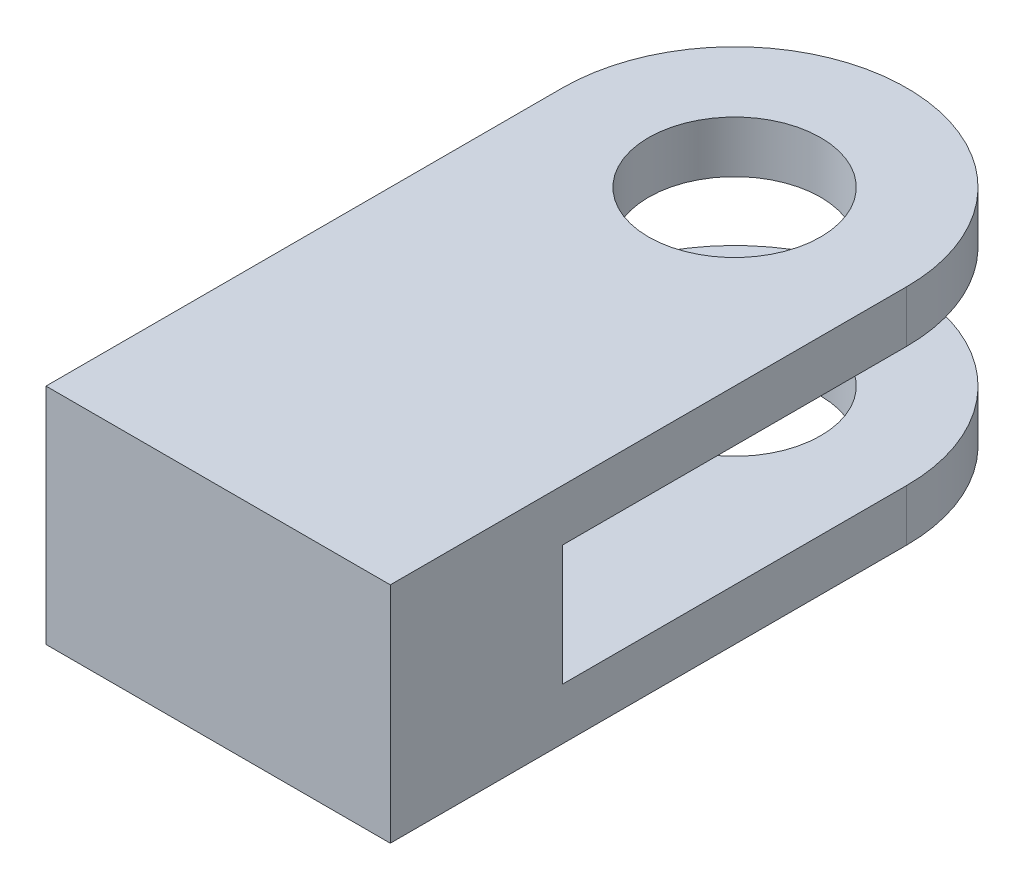
ISO-10303-21;
HEADER;
FILE_DESCRIPTION(('STEP AP214'),'2;1');
FILE_NAME('part.step','',(''),(''),'','','');
FILE_SCHEMA(('AUTOMOTIVE_DESIGN { 1 0 10303 214 1 1 1 1 }'));
ENDSEC;
DATA;
#1=APPLICATION_CONTEXT('core data for automotive mechanical design processes');
#2=APPLICATION_PROTOCOL_DEFINITION('international standard','automotive_design',2000,#1);
#3=PRODUCT_CONTEXT('',#1,'mechanical');
#4=PRODUCT('Part','Part','',(#3));
#5=PRODUCT_RELATED_PRODUCT_CATEGORY('part','',(#4));
#6=PRODUCT_DEFINITION_FORMATION('','',#4);
#7=PRODUCT_DEFINITION_CONTEXT('part definition',#1,'design');
#8=PRODUCT_DEFINITION('design','',#6,#7);
#9=PRODUCT_DEFINITION_SHAPE('','',#8);
#10=(LENGTH_UNIT() NAMED_UNIT(*) SI_UNIT(.MILLI.,.METRE.));
#11=(NAMED_UNIT(*) PLANE_ANGLE_UNIT() SI_UNIT($,.RADIAN.));
#12=(NAMED_UNIT(*) SI_UNIT($,.STERADIAN.) SOLID_ANGLE_UNIT());
#13=UNCERTAINTY_MEASURE_WITH_UNIT(LENGTH_MEASURE(1.E-05),#10,'distance_accuracy_value','');
#14=(GEOMETRIC_REPRESENTATION_CONTEXT(3) GLOBAL_UNCERTAINTY_ASSIGNED_CONTEXT((#13)) GLOBAL_UNIT_ASSIGNED_CONTEXT((#10,
#11,#12)) REPRESENTATION_CONTEXT('',''));
#15=CARTESIAN_POINT('',(0.,0.,0.));
#16=DIRECTION('',(0.,0.,1.));
#17=DIRECTION('',(1.,0.,0.));
#18=AXIS2_PLACEMENT_3D('',#15,#16,#17);
#19=CARTESIAN_POINT('',(10.,6.5,0.));
#20=DIRECTION('',(-1.,0.,0.));
#21=DIRECTION('',(0.,0.,1.));
#22=AXIS2_PLACEMENT_3D('',#19,#20,#21);
#23=PLANE('',#22);
#24=DIRECTION('',(0.,0.,-1.));
#25=VECTOR('',#24,1.);
#26=CARTESIAN_POINT('',(10.,3.5,20.));
#27=LINE('',#26,#25);
#28=CARTESIAN_POINT('',(10.,3.5,20.));
#29=VERTEX_POINT('',#28);
#30=CARTESIAN_POINT('',(10.,3.5,0.));
#31=VERTEX_POINT('',#30);
#32=EDGE_CURVE('E118',#29,#31,#27,.T.);
#33=ORIENTED_EDGE('',*,*,#32,.T.);
#34=DIRECTION('',(0.,-1.,0.));
#35=VECTOR('',#34,1.);
#36=CARTESIAN_POINT('',(10.,6.5,0.));
#37=LINE('',#36,#35);
#38=CARTESIAN_POINT('',(10.,6.5,0.));
#39=VERTEX_POINT('',#38);
#40=EDGE_CURVE('E42',#39,#31,#37,.T.);
#41=ORIENTED_EDGE('',*,*,#40,.F.);
#42=DIRECTION('',(0.,0.,-1.));
#43=VECTOR('',#42,1.);
#44=CARTESIAN_POINT('',(10.,6.5,0.));
#45=LINE('',#44,#43);
#46=CARTESIAN_POINT('',(10.,6.5,30.));
#47=VERTEX_POINT('',#46);
#48=EDGE_CURVE('E85',#47,#39,#45,.T.);
#49=ORIENTED_EDGE('',*,*,#48,.F.);
#50=DIRECTION('',(0.,-1.,0.));
#51=VECTOR('',#50,1.);
#52=CARTESIAN_POINT('',(10.,6.5,30.));
#53=LINE('',#52,#51);
#54=CARTESIAN_POINT('',(10.,-6.5,30.));
#55=VERTEX_POINT('',#54);
#56=EDGE_CURVE('E11',#47,#55,#53,.T.);
#57=ORIENTED_EDGE('',*,*,#56,.T.);
#58=DIRECTION('',(0.,0.,-1.));
#59=VECTOR('',#58,1.);
#60=CARTESIAN_POINT('',(10.,-6.5,0.));
#61=LINE('',#60,#59);
#62=CARTESIAN_POINT('',(10.,-6.5,0.));
#63=VERTEX_POINT('',#62);
#64=EDGE_CURVE('E152',#55,#63,#61,.T.);
#65=ORIENTED_EDGE('',*,*,#64,.T.);
#66=CARTESIAN_POINT('',(10.,-3.5,0.));
#67=VERTEX_POINT('',#66);
#68=EDGE_CURVE('E164',#67,#63,#37,.T.);
#69=ORIENTED_EDGE('',*,*,#68,.F.);
#70=DIRECTION('',(0.,0.,-1.));
#71=VECTOR('',#70,1.);
#72=CARTESIAN_POINT('',(10.,-3.5,20.));
#73=LINE('',#72,#71);
#74=CARTESIAN_POINT('',(10.,-3.5,20.));
#75=VERTEX_POINT('',#74);
#76=EDGE_CURVE('E126',#75,#67,#73,.T.);
#77=ORIENTED_EDGE('',*,*,#76,.F.);
#78=DIRECTION('',(0.,1.,0.));
#79=VECTOR('',#78,1.);
#80=CARTESIAN_POINT('',(10.,-3.5,20.));
#81=LINE('',#80,#79);
#82=EDGE_CURVE('E109',#75,#29,#81,.T.);
#83=ORIENTED_EDGE('',*,*,#82,.T.);
#84=EDGE_LOOP('',(#33,#41,#49,#57,#65,#69,#77,#83));
#85=FACE_BOUND('',#84,.T.);
#86=ADVANCED_FACE('F33',(#85),#23,.F.);
#87=CARTESIAN_POINT('',(0.,6.5,0.));
#88=DIRECTION('',(0.,-1.,0.));
#89=DIRECTION('',(0.,0.,-1.));
#90=AXIS2_PLACEMENT_3D('',#87,#88,#89);
#91=CYLINDRICAL_SURFACE('',#90,10.);
#92=CARTESIAN_POINT('',(0.,3.5,0.));
#93=DIRECTION('',(0.,-1.,0.));
#94=DIRECTION('',(0.,0.,-1.));
#95=AXIS2_PLACEMENT_3D('',#92,#93,#94);
#96=CIRCLE('',#95,10.);
#97=CARTESIAN_POINT('',(-10.,3.5,0.));
#98=VERTEX_POINT('',#97);
#99=EDGE_CURVE('E120',#98,#31,#96,.T.);
#100=ORIENTED_EDGE('',*,*,#99,.F.);
#101=DIRECTION('',(0.,-1.,0.));
#102=VECTOR('',#101,1.);
#103=CARTESIAN_POINT('',(-10.,6.5,0.));
#104=LINE('',#103,#102);
#105=CARTESIAN_POINT('',(-10.,6.5,0.));
#106=VERTEX_POINT('',#105);
#107=EDGE_CURVE('E161',#106,#98,#104,.T.);
#108=ORIENTED_EDGE('',*,*,#107,.F.);
#109=CARTESIAN_POINT('',(0.,6.5,0.));
#110=DIRECTION('',(0.,1.,0.));
#111=DIRECTION('',(0.,0.,-1.));
#112=AXIS2_PLACEMENT_3D('',#109,#110,#111);
#113=CIRCLE('',#112,10.);
#114=EDGE_CURVE('E146',#39,#106,#113,.T.);
#115=ORIENTED_EDGE('',*,*,#114,.F.);
#116=ORIENTED_EDGE('',*,*,#40,.T.);
#117=EDGE_LOOP('',(#100,#108,#115,#116));
#118=FACE_BOUND('',#117,.T.);
#119=ADVANCED_FACE('F180',(#118),#91,.T.);
#120=CARTESIAN_POINT('',(0.,-3.5,0.));
#121=DIRECTION('',(0.,1.,0.));
#122=DIRECTION('',(0.,0.,1.));
#123=AXIS2_PLACEMENT_3D('',#120,#121,#122);
#124=CIRCLE('',#123,10.);
#125=CARTESIAN_POINT('',(-10.,-3.5,0.));
#126=VERTEX_POINT('',#125);
#127=EDGE_CURVE('E122',#67,#126,#124,.T.);
#128=ORIENTED_EDGE('',*,*,#127,.F.);
#129=ORIENTED_EDGE('',*,*,#68,.T.);
#130=CARTESIAN_POINT('',(0.,-6.5,0.));
#131=DIRECTION('',(0.,1.,0.));
#132=DIRECTION('',(0.,0.,-1.));
#133=AXIS2_PLACEMENT_3D('',#130,#131,#132);
#134=CIRCLE('',#133,10.);
#135=CARTESIAN_POINT('',(-10.,-6.5,0.));
#136=VERTEX_POINT('',#135);
#137=EDGE_CURVE('E155',#63,#136,#134,.T.);
#138=ORIENTED_EDGE('',*,*,#137,.T.);
#139=EDGE_CURVE('E160',#126,#136,#104,.T.);
#140=ORIENTED_EDGE('',*,*,#139,.F.);
#141=EDGE_LOOP('',(#128,#129,#138,#140));
#142=FACE_BOUND('',#141,.T.);
#143=ADVANCED_FACE('F169',(#142),#91,.T.);
#144=CARTESIAN_POINT('',(-10.,6.5,30.));
#145=DIRECTION('',(1.,0.,0.));
#146=DIRECTION('',(0.,0.,-1.));
#147=AXIS2_PLACEMENT_3D('',#144,#145,#146);
#148=PLANE('',#147);
#149=DIRECTION('',(0.,0.,-1.));
#150=VECTOR('',#149,1.);
#151=CARTESIAN_POINT('',(-10.,3.5,20.));
#152=LINE('',#151,#150);
#153=CARTESIAN_POINT('',(-10.,3.5,20.));
#154=VERTEX_POINT('',#153);
#155=EDGE_CURVE('E123',#154,#98,#152,.T.);
#156=ORIENTED_EDGE('',*,*,#155,.F.);
#157=DIRECTION('',(0.,-1.,0.));
#158=VECTOR('',#157,1.);
#159=CARTESIAN_POINT('',(-10.,-3.5,20.));
#160=LINE('',#159,#158);
#161=CARTESIAN_POINT('',(-10.,-3.5,20.));
#162=VERTEX_POINT('',#161);
#163=EDGE_CURVE('E112',#154,#162,#160,.T.);
#164=ORIENTED_EDGE('',*,*,#163,.T.);
#165=DIRECTION('',(0.,0.,-1.));
#166=VECTOR('',#165,1.);
#167=CARTESIAN_POINT('',(-10.,-3.5,20.));
#168=LINE('',#167,#166);
#169=EDGE_CURVE('E136',#162,#126,#168,.T.);
#170=ORIENTED_EDGE('',*,*,#169,.T.);
#171=ORIENTED_EDGE('',*,*,#139,.T.);
#172=DIRECTION('',(0.,0.,1.));
#173=VECTOR('',#172,1.);
#174=CARTESIAN_POINT('',(-10.,-6.5,30.));
#175=LINE('',#174,#173);
#176=CARTESIAN_POINT('',(-10.,-6.5,30.));
#177=VERTEX_POINT('',#176);
#178=EDGE_CURVE('E78',#136,#177,#175,.T.);
#179=ORIENTED_EDGE('',*,*,#178,.T.);
#180=DIRECTION('',(0.,-1.,0.));
#181=VECTOR('',#180,1.);
#182=CARTESIAN_POINT('',(-10.,6.5,30.));
#183=LINE('',#182,#181);
#184=CARTESIAN_POINT('',(-10.,6.5,30.));
#185=VERTEX_POINT('',#184);
#186=EDGE_CURVE('E149',#185,#177,#183,.T.);
#187=ORIENTED_EDGE('',*,*,#186,.F.);
#188=DIRECTION('',(0.,0.,1.));
#189=VECTOR('',#188,1.);
#190=CARTESIAN_POINT('',(-10.,6.5,30.));
#191=LINE('',#190,#189);
#192=EDGE_CURVE('E58',#106,#185,#191,.T.);
#193=ORIENTED_EDGE('',*,*,#192,.F.);
#194=ORIENTED_EDGE('',*,*,#107,.T.);
#195=EDGE_LOOP('',(#156,#164,#170,#171,#179,#187,#193,#194));
#196=FACE_BOUND('',#195,.T.);
#197=ADVANCED_FACE('F178',(#196),#148,.F.);
#198=CARTESIAN_POINT('',(10.,6.5,30.));
#199=DIRECTION('',(0.,0.,-1.));
#200=DIRECTION('',(-1.,0.,0.));
#201=AXIS2_PLACEMENT_3D('',#198,#199,#200);
#202=PLANE('',#201);
#203=DIRECTION('',(1.,0.,0.));
#204=VECTOR('',#203,1.);
#205=CARTESIAN_POINT('',(10.,-6.5,30.));
#206=LINE('',#205,#204);
#207=EDGE_CURVE('E142',#177,#55,#206,.T.);
#208=ORIENTED_EDGE('',*,*,#207,.T.);
#209=ORIENTED_EDGE('',*,*,#56,.F.);
#210=DIRECTION('',(1.,0.,0.));
#211=VECTOR('',#210,1.);
#212=CARTESIAN_POINT('',(10.,6.5,30.));
#213=LINE('',#212,#211);
#214=EDGE_CURVE('E143',#185,#47,#213,.T.);
#215=ORIENTED_EDGE('',*,*,#214,.F.);
#216=ORIENTED_EDGE('',*,*,#186,.T.);
#217=EDGE_LOOP('',(#208,#209,#215,#216));
#218=FACE_BOUND('',#217,.T.);
#219=ADVANCED_FACE('F35',(#218),#202,.F.);
#220=CARTESIAN_POINT('',(0.,6.5,0.));
#221=DIRECTION('',(0.,-1.,0.));
#222=DIRECTION('',(0.,0.,-1.));
#223=AXIS2_PLACEMENT_3D('',#220,#221,#222);
#224=PLANE('',#223);
#225=CARTESIAN_POINT('',(0.,6.5,0.));
#226=DIRECTION('',(0.,1.,0.));
#227=DIRECTION('',(0.,0.,1.));
#228=AXIS2_PLACEMENT_3D('',#225,#226,#227);
#229=CIRCLE('',#228,5.);
#230=CARTESIAN_POINT('',(0.,6.5,5.));
#231=VERTEX_POINT('',#230);
#232=EDGE_CURVE('E291',#231,#231,#229,.T.);
#233=ORIENTED_EDGE('',*,*,#232,.F.);
#234=EDGE_LOOP('',(#233));
#235=FACE_BOUND('',#234,.T.);
#236=ORIENTED_EDGE('',*,*,#214,.T.);
#237=ORIENTED_EDGE('',*,*,#48,.T.);
#238=ORIENTED_EDGE('',*,*,#114,.T.);
#239=ORIENTED_EDGE('',*,*,#192,.T.);
#240=EDGE_LOOP('',(#236,#237,#238,#239));
#241=FACE_BOUND('',#240,.T.);
#242=ADVANCED_FACE('F181',(#235,#241),#224,.F.);
#243=CARTESIAN_POINT('',(0.,-6.5,0.));
#244=DIRECTION('',(0.,-1.,0.));
#245=DIRECTION('',(0.,0.,-1.));
#246=AXIS2_PLACEMENT_3D('',#243,#244,#245);
#247=PLANE('',#246);
#248=CARTESIAN_POINT('',(0.,-6.5,0.));
#249=DIRECTION('',(0.,1.,0.));
#250=DIRECTION('',(0.,0.,1.));
#251=AXIS2_PLACEMENT_3D('',#248,#249,#250);
#252=CIRCLE('',#251,5.);
#253=CARTESIAN_POINT('',(0.,-6.5,5.));
#254=VERTEX_POINT('',#253);
#255=EDGE_CURVE('E289',#254,#254,#252,.T.);
#256=ORIENTED_EDGE('',*,*,#255,.T.);
#257=EDGE_LOOP('',(#256));
#258=FACE_BOUND('',#257,.T.);
#259=ORIENTED_EDGE('',*,*,#207,.F.);
#260=ORIENTED_EDGE('',*,*,#178,.F.);
#261=ORIENTED_EDGE('',*,*,#137,.F.);
#262=ORIENTED_EDGE('',*,*,#64,.F.);
#263=EDGE_LOOP('',(#259,#260,#261,#262));
#264=FACE_BOUND('',#263,.T.);
#265=ADVANCED_FACE('F175',(#258,#264),#247,.T.);
#266=CARTESIAN_POINT('',(-10.,3.5,20.));
#267=DIRECTION('',(0.,-1.,0.));
#268=DIRECTION('',(0.,0.,-1.));
#269=AXIS2_PLACEMENT_3D('',#266,#267,#268);
#270=PLANE('',#269);
#271=CARTESIAN_POINT('',(0.,3.5,0.));
#272=DIRECTION('',(0.,-1.,0.));
#273=DIRECTION('',(0.,0.,-1.));
#274=AXIS2_PLACEMENT_3D('',#271,#272,#273);
#275=CIRCLE('',#274,5.);
#276=CARTESIAN_POINT('',(0.,3.5,5.));
#277=VERTEX_POINT('',#276);
#278=EDGE_CURVE('E127',#277,#277,#275,.T.);
#279=ORIENTED_EDGE('',*,*,#278,.F.);
#280=EDGE_LOOP('',(#279));
#281=FACE_BOUND('',#280,.T.);
#282=ORIENTED_EDGE('',*,*,#99,.T.);
#283=ORIENTED_EDGE('',*,*,#32,.F.);
#284=DIRECTION('',(-1.,0.,0.));
#285=VECTOR('',#284,1.);
#286=CARTESIAN_POINT('',(-10.,3.5,20.));
#287=LINE('',#286,#285);
#288=EDGE_CURVE('E105',#29,#154,#287,.T.);
#289=ORIENTED_EDGE('',*,*,#288,.T.);
#290=ORIENTED_EDGE('',*,*,#155,.T.);
#291=EDGE_LOOP('',(#282,#283,#289,#290));
#292=FACE_BOUND('',#291,.T.);
#293=ADVANCED_FACE('F119',(#281,#292),#270,.T.);
#294=CARTESIAN_POINT('',(-10.,-3.5,20.));
#295=DIRECTION('',(0.,1.,0.));
#296=DIRECTION('',(0.,0.,1.));
#297=AXIS2_PLACEMENT_3D('',#294,#295,#296);
#298=PLANE('',#297);
#299=CARTESIAN_POINT('',(0.,-3.5,0.));
#300=DIRECTION('',(0.,1.,0.));
#301=DIRECTION('',(0.,0.,1.));
#302=AXIS2_PLACEMENT_3D('',#299,#300,#301);
#303=CIRCLE('',#302,5.);
#304=CARTESIAN_POINT('',(0.,-3.5,5.));
#305=VERTEX_POINT('',#304);
#306=EDGE_CURVE('E37',#305,#305,#303,.T.);
#307=ORIENTED_EDGE('',*,*,#306,.F.);
#308=EDGE_LOOP('',(#307));
#309=FACE_BOUND('',#308,.T.);
#310=ORIENTED_EDGE('',*,*,#127,.T.);
#311=ORIENTED_EDGE('',*,*,#169,.F.);
#312=DIRECTION('',(1.,0.,0.));
#313=VECTOR('',#312,1.);
#314=CARTESIAN_POINT('',(-10.,-3.5,20.));
#315=LINE('',#314,#313);
#316=EDGE_CURVE('E49',#162,#75,#315,.T.);
#317=ORIENTED_EDGE('',*,*,#316,.T.);
#318=ORIENTED_EDGE('',*,*,#76,.T.);
#319=EDGE_LOOP('',(#310,#311,#317,#318));
#320=FACE_BOUND('',#319,.T.);
#321=ADVANCED_FACE('F245',(#309,#320),#298,.T.);
#322=CARTESIAN_POINT('',(0.,0.,20.));
#323=DIRECTION('',(0.,0.,-1.));
#324=DIRECTION('',(-1.,0.,0.));
#325=AXIS2_PLACEMENT_3D('',#322,#323,#324);
#326=PLANE('',#325);
#327=ORIENTED_EDGE('',*,*,#82,.F.);
#328=ORIENTED_EDGE('',*,*,#316,.F.);
#329=ORIENTED_EDGE('',*,*,#163,.F.);
#330=ORIENTED_EDGE('',*,*,#288,.F.);
#331=EDGE_LOOP('',(#327,#328,#329,#330));
#332=FACE_BOUND('',#331,.T.);
#333=ADVANCED_FACE('F107',(#332),#326,.T.);
#334=CARTESIAN_POINT('',(0.,-6.5,0.));
#335=DIRECTION('',(0.,1.,0.));
#336=DIRECTION('',(0.,0.,1.));
#337=AXIS2_PLACEMENT_3D('',#334,#335,#336);
#338=CYLINDRICAL_SURFACE('',#337,5.);
#339=CARTESIAN_POINT('',(0.,-3.5,5.));
#340=CARTESIAN_POINT('',(0.,-3.53125,5.));
#341=CARTESIAN_POINT('',(0.,-3.5625,5.));
#342=CARTESIAN_POINT('',(0.,-3.625,5.));
#343=CARTESIAN_POINT('',(0.,-3.65625,5.));
#344=CARTESIAN_POINT('',(0.,-3.71875,5.));
#345=CARTESIAN_POINT('',(0.,-3.75,5.));
#346=CARTESIAN_POINT('',(0.,-3.8125,5.));
#347=CARTESIAN_POINT('',(0.,-3.84375,5.));
#348=CARTESIAN_POINT('',(0.,-3.90625,5.));
#349=CARTESIAN_POINT('',(0.,-3.9375,5.));
#350=CARTESIAN_POINT('',(0.,-4.,5.));
#351=CARTESIAN_POINT('',(0.,-4.03125,5.));
#352=CARTESIAN_POINT('',(0.,-4.09375,5.));
#353=CARTESIAN_POINT('',(0.,-4.125,5.));
#354=CARTESIAN_POINT('',(0.,-4.1875,5.));
#355=CARTESIAN_POINT('',(0.,-4.21875,5.));
#356=CARTESIAN_POINT('',(0.,-4.28125,5.));
#357=CARTESIAN_POINT('',(0.,-4.3125,5.));
#358=CARTESIAN_POINT('',(0.,-4.375,5.));
#359=CARTESIAN_POINT('',(0.,-4.40625,5.));
#360=CARTESIAN_POINT('',(0.,-4.46875,5.));
#361=CARTESIAN_POINT('',(0.,-4.5,5.));
#362=CARTESIAN_POINT('',(0.,-4.5625,5.));
#363=CARTESIAN_POINT('',(0.,-4.59375,5.));
#364=CARTESIAN_POINT('',(0.,-4.65625,5.));
#365=CARTESIAN_POINT('',(0.,-4.6875,5.));
#366=CARTESIAN_POINT('',(0.,-4.75,5.));
#367=CARTESIAN_POINT('',(0.,-4.78125,5.));
#368=CARTESIAN_POINT('',(0.,-4.84375,5.));
#369=CARTESIAN_POINT('',(0.,-4.875,5.));
#370=CARTESIAN_POINT('',(0.,-4.9375,5.));
#371=CARTESIAN_POINT('',(0.,-4.96875,5.));
#372=CARTESIAN_POINT('',(0.,-5.03125,5.));
#373=CARTESIAN_POINT('',(0.,-5.0625,5.));
#374=CARTESIAN_POINT('',(0.,-5.125,5.));
#375=CARTESIAN_POINT('',(0.,-5.15625,5.));
#376=CARTESIAN_POINT('',(0.,-5.21875,5.));
#377=CARTESIAN_POINT('',(0.,-5.25,5.));
#378=CARTESIAN_POINT('',(0.,-5.3125,5.));
#379=CARTESIAN_POINT('',(0.,-5.34375,5.));
#380=CARTESIAN_POINT('',(0.,-5.40625,5.));
#381=CARTESIAN_POINT('',(0.,-5.4375,5.));
#382=CARTESIAN_POINT('',(0.,-5.5,5.));
#383=CARTESIAN_POINT('',(0.,-5.53125,5.));
#384=CARTESIAN_POINT('',(0.,-5.59375,5.));
#385=CARTESIAN_POINT('',(0.,-5.625,5.));
#386=CARTESIAN_POINT('',(0.,-5.6875,5.));
#387=CARTESIAN_POINT('',(0.,-5.71875,5.));
#388=CARTESIAN_POINT('',(0.,-5.78125,5.));
#389=CARTESIAN_POINT('',(0.,-5.8125,5.));
#390=CARTESIAN_POINT('',(0.,-5.875,5.));
#391=CARTESIAN_POINT('',(0.,-5.90625,5.));
#392=CARTESIAN_POINT('',(0.,-5.96875,5.));
#393=CARTESIAN_POINT('',(0.,-6.,5.));
#394=CARTESIAN_POINT('',(0.,-6.0625,5.));
#395=CARTESIAN_POINT('',(0.,-6.09375,5.));
#396=CARTESIAN_POINT('',(0.,-6.15625,5.));
#397=CARTESIAN_POINT('',(0.,-6.1875,5.));
#398=CARTESIAN_POINT('',(0.,-6.25,5.));
#399=CARTESIAN_POINT('',(0.,-6.28125,5.));
#400=CARTESIAN_POINT('',(0.,-6.34375,5.));
#401=CARTESIAN_POINT('',(0.,-6.375,5.));
#402=CARTESIAN_POINT('',(0.,-6.4375,5.));
#403=CARTESIAN_POINT('',(0.,-6.46875,5.));
#404=CARTESIAN_POINT('',(0.,-6.5,5.));
#405=B_SPLINE_CURVE_WITH_KNOTS('',3,(#339,#340,#341,#342,#343,#344,#345,#346,#347,#348,#349,
#350,#351,#352,#353,#354,#355,#356,#357,#358,#359,#360,#361,#362,#363,#364,#365,#366,#367,#368,
#369,#370,#371,#372,#373,#374,#375,#376,#377,#378,#379,#380,#381,#382,#383,#384,#385,#386,#387,
#388,#389,#390,#391,#392,#393,#394,#395,#396,#397,#398,#399,#400,#401,#402,#403,#404),
.UNSPECIFIED.,.F.,.F.,(4,2,2,2,2,2,2,2,2,2,2,2,2,2,2,2,2,2,2,2,2,2,2,2,2,2,2,2,2,2,2,2,4),(0.,
0.0937500000000001,0.1875,0.28125,0.375,0.46875,0.5625,0.65625,0.75,0.84375,0.9375,1.03125,
1.125,1.21875,1.3125,1.40625,1.5,1.59375,1.6875,1.78125,1.875,1.96875,2.0625,2.15625,2.25,
2.34375,2.4375,2.53125,2.625,2.71875,2.8125,2.90625,3.),.UNSPECIFIED.);
#406=EDGE_CURVE('BSEAM244',#305,#254,#405,.T.);
#407=ORIENTED_EDGE('',*,*,#306,.T.);
#408=ORIENTED_EDGE('',*,*,#255,.F.);
#409=ORIENTED_EDGE('',*,*,#406,.T.);
#410=ORIENTED_EDGE('',*,*,#406,.F.);
#411=EDGE_LOOP('',(#407,#409,#408,#410));
#412=FACE_BOUND('',#411,.T.);
#413=ADVANCED_FACE('F244',(#412),#338,.F.);
#414=CARTESIAN_POINT('',(0.,3.5,5.));
#415=CARTESIAN_POINT('',(0.,3.53125,5.));
#416=CARTESIAN_POINT('',(0.,3.5625,5.));
#417=CARTESIAN_POINT('',(0.,3.625,5.));
#418=CARTESIAN_POINT('',(0.,3.65625,5.));
#419=CARTESIAN_POINT('',(0.,3.71875,5.));
#420=CARTESIAN_POINT('',(0.,3.75,5.));
#421=CARTESIAN_POINT('',(0.,3.8125,5.));
#422=CARTESIAN_POINT('',(0.,3.84375,5.));
#423=CARTESIAN_POINT('',(0.,3.90625,5.));
#424=CARTESIAN_POINT('',(0.,3.9375,5.));
#425=CARTESIAN_POINT('',(0.,4.,5.));
#426=CARTESIAN_POINT('',(0.,4.03125,5.));
#427=CARTESIAN_POINT('',(0.,4.09375,5.));
#428=CARTESIAN_POINT('',(0.,4.125,5.));
#429=CARTESIAN_POINT('',(0.,4.1875,5.));
#430=CARTESIAN_POINT('',(0.,4.21875,5.));
#431=CARTESIAN_POINT('',(0.,4.28125,5.));
#432=CARTESIAN_POINT('',(0.,4.3125,5.));
#433=CARTESIAN_POINT('',(0.,4.375,5.));
#434=CARTESIAN_POINT('',(0.,4.40625,5.));
#435=CARTESIAN_POINT('',(0.,4.46875,5.));
#436=CARTESIAN_POINT('',(0.,4.5,5.));
#437=CARTESIAN_POINT('',(0.,4.5625,5.));
#438=CARTESIAN_POINT('',(0.,4.59375,5.));
#439=CARTESIAN_POINT('',(0.,4.65625,5.));
#440=CARTESIAN_POINT('',(0.,4.6875,5.));
#441=CARTESIAN_POINT('',(0.,4.75,5.));
#442=CARTESIAN_POINT('',(0.,4.78125,5.));
#443=CARTESIAN_POINT('',(0.,4.84375,5.));
#444=CARTESIAN_POINT('',(0.,4.875,5.));
#445=CARTESIAN_POINT('',(0.,4.9375,5.));
#446=CARTESIAN_POINT('',(0.,4.96875,5.));
#447=CARTESIAN_POINT('',(0.,5.03125,5.));
#448=CARTESIAN_POINT('',(0.,5.0625,5.));
#449=CARTESIAN_POINT('',(0.,5.125,5.));
#450=CARTESIAN_POINT('',(0.,5.15625,5.));
#451=CARTESIAN_POINT('',(0.,5.21875,5.));
#452=CARTESIAN_POINT('',(0.,5.25,5.));
#453=CARTESIAN_POINT('',(0.,5.3125,5.));
#454=CARTESIAN_POINT('',(0.,5.34375,5.));
#455=CARTESIAN_POINT('',(0.,5.40625,5.));
#456=CARTESIAN_POINT('',(0.,5.4375,5.));
#457=CARTESIAN_POINT('',(0.,5.5,5.));
#458=CARTESIAN_POINT('',(0.,5.53125,5.));
#459=CARTESIAN_POINT('',(0.,5.59375,5.));
#460=CARTESIAN_POINT('',(0.,5.625,5.));
#461=CARTESIAN_POINT('',(0.,5.6875,5.));
#462=CARTESIAN_POINT('',(0.,5.71875,5.));
#463=CARTESIAN_POINT('',(0.,5.78125,5.));
#464=CARTESIAN_POINT('',(0.,5.8125,5.));
#465=CARTESIAN_POINT('',(0.,5.875,5.));
#466=CARTESIAN_POINT('',(0.,5.90625,5.));
#467=CARTESIAN_POINT('',(0.,5.96875,5.));
#468=CARTESIAN_POINT('',(0.,6.,5.));
#469=CARTESIAN_POINT('',(0.,6.0625,5.));
#470=CARTESIAN_POINT('',(0.,6.09375,5.));
#471=CARTESIAN_POINT('',(0.,6.15625,5.));
#472=CARTESIAN_POINT('',(0.,6.1875,5.));
#473=CARTESIAN_POINT('',(0.,6.25,5.));
#474=CARTESIAN_POINT('',(0.,6.28125,5.));
#475=CARTESIAN_POINT('',(0.,6.34375,5.));
#476=CARTESIAN_POINT('',(0.,6.375,5.));
#477=CARTESIAN_POINT('',(0.,6.4375,5.));
#478=CARTESIAN_POINT('',(0.,6.46875,5.));
#479=CARTESIAN_POINT('',(0.,6.5,5.));
#480=B_SPLINE_CURVE_WITH_KNOTS('',3,(#414,#415,#416,#417,#418,#419,#420,#421,#422,#423,#424,
#425,#426,#427,#428,#429,#430,#431,#432,#433,#434,#435,#436,#437,#438,#439,#440,#441,#442,#443,
#444,#445,#446,#447,#448,#449,#450,#451,#452,#453,#454,#455,#456,#457,#458,#459,#460,#461,#462,
#463,#464,#465,#466,#467,#468,#469,#470,#471,#472,#473,#474,#475,#476,#477,#478,#479),
.UNSPECIFIED.,.F.,.F.,(4,2,2,2,2,2,2,2,2,2,2,2,2,2,2,2,2,2,2,2,2,2,2,2,2,2,2,2,2,2,2,2,4),(0.,
0.0937500000000001,0.1875,0.28125,0.375,0.46875,0.5625,0.656250000000001,0.750000000000001,
0.843749999999999,0.937499999999999,1.03125,1.125,1.21875,1.3125,1.40625,1.5,1.59375,1.6875,
1.78125,1.875,1.96875,2.0625,2.15625,2.25,2.34375,2.4375,2.53125,2.625,2.71875,2.8125,2.90625,
3.),.UNSPECIFIED.);
#481=EDGE_CURVE('BSEAM260',#277,#231,#480,.T.);
#482=ORIENTED_EDGE('',*,*,#278,.T.);
#483=ORIENTED_EDGE('',*,*,#232,.T.);
#484=ORIENTED_EDGE('',*,*,#481,.T.);
#485=ORIENTED_EDGE('',*,*,#481,.F.);
#486=EDGE_LOOP('',(#482,#484,#483,#485));
#487=FACE_BOUND('',#486,.T.);
#488=ADVANCED_FACE('F260',(#487),#338,.F.);
#489=CLOSED_SHELL('',(#86,#119,#143,#197,#219,#242,#265,#293,#321,#333,#413,#488));
#490=MANIFOLD_SOLID_BREP('B2',#489);
#491=ADVANCED_BREP_SHAPE_REPRESENTATION('',(#18,#490),#14);
#492=SHAPE_DEFINITION_REPRESENTATION(#9,#491);
ENDSEC;
END-ISO-10303-21;
